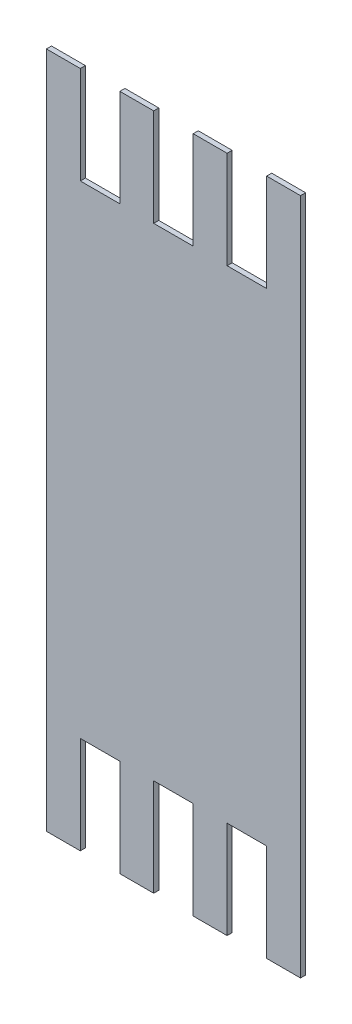
ISO-10303-21;
HEADER;
FILE_DESCRIPTION(('STEP AP214'),'2;1');
FILE_NAME('part.step','',(''),(''),'','','');
FILE_SCHEMA(('AUTOMOTIVE_DESIGN { 1 0 10303 214 1 1 1 1 }'));
ENDSEC;
DATA;
#1=APPLICATION_CONTEXT('core data for automotive mechanical design processes');
#2=APPLICATION_PROTOCOL_DEFINITION('international standard','automotive_design',2000,#1);
#3=PRODUCT_CONTEXT('',#1,'mechanical');
#4=PRODUCT('Part','Part','',(#3));
#5=PRODUCT_RELATED_PRODUCT_CATEGORY('part','',(#4));
#6=PRODUCT_DEFINITION_FORMATION('','',#4);
#7=PRODUCT_DEFINITION_CONTEXT('part definition',#1,'design');
#8=PRODUCT_DEFINITION('design','',#6,#7);
#9=PRODUCT_DEFINITION_SHAPE('','',#8);
#10=(LENGTH_UNIT() NAMED_UNIT(*) SI_UNIT(.MILLI.,.METRE.));
#11=(NAMED_UNIT(*) PLANE_ANGLE_UNIT() SI_UNIT($,.RADIAN.));
#12=(NAMED_UNIT(*) SI_UNIT($,.STERADIAN.) SOLID_ANGLE_UNIT());
#13=UNCERTAINTY_MEASURE_WITH_UNIT(LENGTH_MEASURE(1.E-05),#10,'distance_accuracy_value','');
#14=(GEOMETRIC_REPRESENTATION_CONTEXT(3) GLOBAL_UNCERTAINTY_ASSIGNED_CONTEXT((#13)) GLOBAL_UNIT_ASSIGNED_CONTEXT((#10,
#11,#12)) REPRESENTATION_CONTEXT('',''));
#15=CARTESIAN_POINT('',(0.,0.,0.));
#16=DIRECTION('',(0.,0.,1.));
#17=DIRECTION('',(1.,0.,0.));
#18=AXIS2_PLACEMENT_3D('',#15,#16,#17);
#19=CARTESIAN_POINT('',(5.904142E-11,-3.9153791E-10,0.03));
#20=DIRECTION('',(0.,0.,1.));
#21=DIRECTION('',(1.,0.,0.));
#22=AXIS2_PLACEMENT_3D('',#19,#20,#21);
#23=PLANE('',#22);
#24=DIRECTION('',(1.,0.,0.));
#25=VECTOR('',#24,1.);
#26=CARTESIAN_POINT('',(0.55,2.,0.03));
#27=LINE('',#26,#25);
#28=CARTESIAN_POINT('',(0.55,2.,0.03));
#29=VERTEX_POINT('',#28);
#30=CARTESIAN_POINT('',(0.75,2.,0.03));
#31=VERTEX_POINT('',#30);
#32=EDGE_CURVE('E649',#29,#31,#27,.T.);
#33=ORIENTED_EDGE('',*,*,#32,.F.);
#34=DIRECTION('',(0.,-1.,0.));
#35=VECTOR('',#34,1.);
#36=CARTESIAN_POINT('',(0.55,2.,0.03));
#37=LINE('',#36,#35);
#38=CARTESIAN_POINT('',(0.55,1.425,0.03));
#39=VERTEX_POINT('',#38);
#40=EDGE_CURVE('E11',#29,#39,#37,.T.);
#41=ORIENTED_EDGE('',*,*,#40,.T.);
#42=DIRECTION('',(-1.,0.,0.));
#43=VECTOR('',#42,1.);
#44=CARTESIAN_POINT('',(0.55,1.425,0.03));
#45=LINE('',#44,#43);
#46=CARTESIAN_POINT('',(0.316666666667,1.425,0.03));
#47=VERTEX_POINT('',#46);
#48=EDGE_CURVE('E330',#39,#47,#45,.T.);
#49=ORIENTED_EDGE('',*,*,#48,.T.);
#50=DIRECTION('',(0.,1.,0.));
#51=VECTOR('',#50,1.);
#52=CARTESIAN_POINT('',(0.316666666667,1.425,0.03));
#53=LINE('',#52,#51);
#54=CARTESIAN_POINT('',(0.316666666667,2.,0.03));
#55=VERTEX_POINT('',#54);
#56=EDGE_CURVE('E322',#47,#55,#53,.T.);
#57=ORIENTED_EDGE('',*,*,#56,.T.);
#58=DIRECTION('',(1.,0.,0.));
#59=VECTOR('',#58,1.);
#60=CARTESIAN_POINT('',(0.116666666667,2.,0.03));
#61=LINE('',#60,#59);
#62=CARTESIAN_POINT('',(0.116666666667,2.,0.03));
#63=VERTEX_POINT('',#62);
#64=EDGE_CURVE('E310',#63,#55,#61,.T.);
#65=ORIENTED_EDGE('',*,*,#64,.F.);
#66=DIRECTION('',(0.,-1.,0.));
#67=VECTOR('',#66,1.);
#68=CARTESIAN_POINT('',(0.116666666667,2.,0.03));
#69=LINE('',#68,#67);
#70=CARTESIAN_POINT('',(0.116666666667,1.425,0.03));
#71=VERTEX_POINT('',#70);
#72=EDGE_CURVE('E265',#63,#71,#69,.T.);
#73=ORIENTED_EDGE('',*,*,#72,.T.);
#74=DIRECTION('',(-1.,0.,0.));
#75=VECTOR('',#74,1.);
#76=CARTESIAN_POINT('',(0.116666666667,1.425,0.03));
#77=LINE('',#76,#75);
#78=CARTESIAN_POINT('',(-0.116666666667,1.425,0.03));
#79=VERTEX_POINT('',#78);
#80=EDGE_CURVE('E260',#71,#79,#77,.T.);
#81=ORIENTED_EDGE('',*,*,#80,.T.);
#82=DIRECTION('',(0.,1.,0.));
#83=VECTOR('',#82,1.);
#84=CARTESIAN_POINT('',(-0.116666666667,1.425,0.03));
#85=LINE('',#84,#83);
#86=CARTESIAN_POINT('',(-0.116666666667,2.,0.03));
#87=VERTEX_POINT('',#86);
#88=EDGE_CURVE('E262',#79,#87,#85,.T.);
#89=ORIENTED_EDGE('',*,*,#88,.T.);
#90=DIRECTION('',(1.,1.668697514E-08,0.));
#91=VECTOR('',#90,1.);
#92=CARTESIAN_POINT('',(-0.316666666667,1.999999996663,0.03));
#93=LINE('',#92,#91);
#94=CARTESIAN_POINT('',(-0.316666666667,1.999999996663,0.03));
#95=VERTEX_POINT('',#94);
#96=EDGE_CURVE('E752',#95,#87,#93,.T.);
#97=ORIENTED_EDGE('',*,*,#96,.F.);
#98=DIRECTION('',(0.,-1.,0.));
#99=VECTOR('',#98,1.);
#100=CARTESIAN_POINT('',(-0.316666666667,1.999999996663,0.03));
#101=LINE('',#100,#99);
#102=CARTESIAN_POINT('',(-0.316666666667,1.425,0.03));
#103=VERTEX_POINT('',#102);
#104=EDGE_CURVE('E755',#95,#103,#101,.T.);
#105=ORIENTED_EDGE('',*,*,#104,.T.);
#106=DIRECTION('',(-1.,0.,0.));
#107=VECTOR('',#106,1.);
#108=CARTESIAN_POINT('',(-0.316666666667,1.425,0.03));
#109=LINE('',#108,#107);
#110=CARTESIAN_POINT('',(-0.55,1.425,0.03));
#111=VERTEX_POINT('',#110);
#112=EDGE_CURVE('E740',#103,#111,#109,.T.);
#113=ORIENTED_EDGE('',*,*,#112,.T.);
#114=DIRECTION('',(0.,1.,0.));
#115=VECTOR('',#114,1.);
#116=CARTESIAN_POINT('',(-0.55,1.425,0.03));
#117=LINE('',#116,#115);
#118=CARTESIAN_POINT('',(-0.55,2.,0.03));
#119=VERTEX_POINT('',#118);
#120=EDGE_CURVE('E663',#111,#119,#117,.T.);
#121=ORIENTED_EDGE('',*,*,#120,.T.);
#122=DIRECTION('',(1.,0.,0.));
#123=VECTOR('',#122,1.);
#124=CARTESIAN_POINT('',(-0.75,2.,0.03));
#125=LINE('',#124,#123);
#126=CARTESIAN_POINT('',(-0.75,2.,0.03));
#127=VERTEX_POINT('',#126);
#128=EDGE_CURVE('E760',#127,#119,#125,.T.);
#129=ORIENTED_EDGE('',*,*,#128,.F.);
#130=DIRECTION('',(0.,1.,0.));
#131=VECTOR('',#130,1.);
#132=CARTESIAN_POINT('',(-0.75,-2.,0.03));
#133=LINE('',#132,#131);
#134=CARTESIAN_POINT('',(-0.75,-2.,0.03));
#135=VERTEX_POINT('',#134);
#136=EDGE_CURVE('E849',#135,#127,#133,.T.);
#137=ORIENTED_EDGE('',*,*,#136,.F.);
#138=DIRECTION('',(-1.,0.,0.));
#139=VECTOR('',#138,1.);
#140=CARTESIAN_POINT('',(-0.55,-2.,0.03));
#141=LINE('',#140,#139);
#142=CARTESIAN_POINT('',(-0.55,-2.,0.03));
#143=VERTEX_POINT('',#142);
#144=EDGE_CURVE('E711',#143,#135,#141,.T.);
#145=ORIENTED_EDGE('',*,*,#144,.F.);
#146=DIRECTION('',(0.,-1.,0.));
#147=VECTOR('',#146,1.);
#148=CARTESIAN_POINT('',(-0.55,-1.425,0.03));
#149=LINE('',#148,#147);
#150=CARTESIAN_POINT('',(-0.55,-1.425,0.03));
#151=VERTEX_POINT('',#150);
#152=EDGE_CURVE('E834',#151,#143,#149,.T.);
#153=ORIENTED_EDGE('',*,*,#152,.F.);
#154=DIRECTION('',(-1.,0.,0.));
#155=VECTOR('',#154,1.);
#156=CARTESIAN_POINT('',(-0.316666666667,-1.425,0.03));
#157=LINE('',#156,#155);
#158=CARTESIAN_POINT('',(-0.316666666667,-1.425,0.03));
#159=VERTEX_POINT('',#158);
#160=EDGE_CURVE('E826',#159,#151,#157,.T.);
#161=ORIENTED_EDGE('',*,*,#160,.F.);
#162=DIRECTION('',(0.,1.,0.));
#163=VECTOR('',#162,1.);
#164=CARTESIAN_POINT('',(-0.316666666667,-2.,0.03));
#165=LINE('',#164,#163);
#166=CARTESIAN_POINT('',(-0.316666666667,-2.,0.03));
#167=VERTEX_POINT('',#166);
#168=EDGE_CURVE('E812',#167,#159,#165,.T.);
#169=ORIENTED_EDGE('',*,*,#168,.F.);
#170=DIRECTION('',(1.,0.,0.));
#171=VECTOR('',#170,1.);
#172=CARTESIAN_POINT('',(-0.316666666667,-2.,0.03));
#173=LINE('',#172,#171);
#174=CARTESIAN_POINT('',(-0.116666666667,-2.,0.03));
#175=VERTEX_POINT('',#174);
#176=EDGE_CURVE('E805',#167,#175,#173,.T.);
#177=ORIENTED_EDGE('',*,*,#176,.T.);
#178=DIRECTION('',(0.,-1.,0.));
#179=VECTOR('',#178,1.);
#180=CARTESIAN_POINT('',(-0.116666666667,-1.425,0.03));
#181=LINE('',#180,#179);
#182=CARTESIAN_POINT('',(-0.116666666667,-1.425,0.03));
#183=VERTEX_POINT('',#182);
#184=EDGE_CURVE('E781',#183,#175,#181,.T.);
#185=ORIENTED_EDGE('',*,*,#184,.F.);
#186=DIRECTION('',(-1.,0.,0.));
#187=VECTOR('',#186,1.);
#188=CARTESIAN_POINT('',(0.116666666667,-1.425,0.03));
#189=LINE('',#188,#187);
#190=CARTESIAN_POINT('',(0.116666666667,-1.425,0.03));
#191=VERTEX_POINT('',#190);
#192=EDGE_CURVE('E718',#191,#183,#189,.T.);
#193=ORIENTED_EDGE('',*,*,#192,.F.);
#194=DIRECTION('',(0.,1.,0.));
#195=VECTOR('',#194,1.);
#196=CARTESIAN_POINT('',(0.116666666667,-2.,0.03));
#197=LINE('',#196,#195);
#198=CARTESIAN_POINT('',(0.116666666667,-2.,0.03));
#199=VERTEX_POINT('',#198);
#200=EDGE_CURVE('E751',#199,#191,#197,.T.);
#201=ORIENTED_EDGE('',*,*,#200,.F.);
#202=DIRECTION('',(1.,0.,0.));
#203=VECTOR('',#202,1.);
#204=CARTESIAN_POINT('',(0.116666666667,-2.,0.03));
#205=LINE('',#204,#203);
#206=CARTESIAN_POINT('',(0.316666666667,-2.,0.03));
#207=VERTEX_POINT('',#206);
#208=EDGE_CURVE('E693',#199,#207,#205,.T.);
#209=ORIENTED_EDGE('',*,*,#208,.T.);
#210=DIRECTION('',(0.,-1.,0.));
#211=VECTOR('',#210,1.);
#212=CARTESIAN_POINT('',(0.316666666667,-1.425,0.03));
#213=LINE('',#212,#211);
#214=CARTESIAN_POINT('',(0.316666666667,-1.425,0.03));
#215=VERTEX_POINT('',#214);
#216=EDGE_CURVE('E677',#215,#207,#213,.T.);
#217=ORIENTED_EDGE('',*,*,#216,.F.);
#218=DIRECTION('',(-1.,0.,0.));
#219=VECTOR('',#218,1.);
#220=CARTESIAN_POINT('',(0.55,-1.425,0.03));
#221=LINE('',#220,#219);
#222=CARTESIAN_POINT('',(0.55,-1.425,0.03));
#223=VERTEX_POINT('',#222);
#224=EDGE_CURVE('E726',#223,#215,#221,.T.);
#225=ORIENTED_EDGE('',*,*,#224,.F.);
#226=DIRECTION('',(0.,1.,0.));
#227=VECTOR('',#226,1.);
#228=CARTESIAN_POINT('',(0.55,-2.,0.03));
#229=LINE('',#228,#227);
#230=CARTESIAN_POINT('',(0.55,-2.,0.03));
#231=VERTEX_POINT('',#230);
#232=EDGE_CURVE('E702',#231,#223,#229,.T.);
#233=ORIENTED_EDGE('',*,*,#232,.F.);
#234=DIRECTION('',(-1.,0.,0.));
#235=VECTOR('',#234,1.);
#236=CARTESIAN_POINT('',(0.75,-2.,0.03));
#237=LINE('',#236,#235);
#238=CARTESIAN_POINT('',(0.75,-2.,0.03));
#239=VERTEX_POINT('',#238);
#240=EDGE_CURVE('E681',#239,#231,#237,.T.);
#241=ORIENTED_EDGE('',*,*,#240,.F.);
#242=DIRECTION('',(0.,-1.,0.));
#243=VECTOR('',#242,1.);
#244=CARTESIAN_POINT('',(0.75,2.,0.03));
#245=LINE('',#244,#243);
#246=EDGE_CURVE('E644',#31,#239,#245,.T.);
#247=ORIENTED_EDGE('',*,*,#246,.F.);
#248=EDGE_LOOP('',(#33,#41,#49,#57,#65,#73,#81,#89,#97,#105,#113,#121,#129,#137,#145,#153,#161,
#169,#177,#185,#193,#201,#209,#217,#225,#233,#241,#247));
#249=FACE_BOUND('',#248,.T.);
#250=ADVANCED_FACE('F17',(#249),#23,.T.);
#251=CARTESIAN_POINT('',(5.904142E-11,-3.9153791E-10,0.));
#252=DIRECTION('',(0.,0.,1.));
#253=DIRECTION('',(1.,0.,0.));
#254=AXIS2_PLACEMENT_3D('',#251,#252,#253);
#255=PLANE('',#254);
#256=DIRECTION('',(1.,0.,0.));
#257=VECTOR('',#256,1.);
#258=CARTESIAN_POINT('',(0.55,2.,0.));
#259=LINE('',#258,#257);
#260=CARTESIAN_POINT('',(0.55,2.,0.));
#261=VERTEX_POINT('',#260);
#262=CARTESIAN_POINT('',(0.75,2.,0.));
#263=VERTEX_POINT('',#262);
#264=EDGE_CURVE('E637',#261,#263,#259,.T.);
#265=ORIENTED_EDGE('',*,*,#264,.T.);
#266=DIRECTION('',(0.,-1.,0.));
#267=VECTOR('',#266,1.);
#268=CARTESIAN_POINT('',(0.75,2.,0.));
#269=LINE('',#268,#267);
#270=CARTESIAN_POINT('',(0.75,-2.,0.));
#271=VERTEX_POINT('',#270);
#272=EDGE_CURVE('E640',#263,#271,#269,.T.);
#273=ORIENTED_EDGE('',*,*,#272,.T.);
#274=DIRECTION('',(-1.,0.,0.));
#275=VECTOR('',#274,1.);
#276=CARTESIAN_POINT('',(0.75,-2.,0.));
#277=LINE('',#276,#275);
#278=CARTESIAN_POINT('',(0.55,-2.,0.));
#279=VERTEX_POINT('',#278);
#280=EDGE_CURVE('E699',#271,#279,#277,.T.);
#281=ORIENTED_EDGE('',*,*,#280,.T.);
#282=DIRECTION('',(0.,1.,0.));
#283=VECTOR('',#282,1.);
#284=CARTESIAN_POINT('',(0.55,-2.,0.));
#285=LINE('',#284,#283);
#286=CARTESIAN_POINT('',(0.55,-1.425,0.));
#287=VERTEX_POINT('',#286);
#288=EDGE_CURVE('E722',#279,#287,#285,.T.);
#289=ORIENTED_EDGE('',*,*,#288,.T.);
#290=DIRECTION('',(-1.,0.,0.));
#291=VECTOR('',#290,1.);
#292=CARTESIAN_POINT('',(0.55,-1.425,0.));
#293=LINE('',#292,#291);
#294=CARTESIAN_POINT('',(0.316666666667,-1.425,0.));
#295=VERTEX_POINT('',#294);
#296=EDGE_CURVE('E673',#287,#295,#293,.T.);
#297=ORIENTED_EDGE('',*,*,#296,.T.);
#298=DIRECTION('',(0.,-1.,0.));
#299=VECTOR('',#298,1.);
#300=CARTESIAN_POINT('',(0.316666666667,-1.425,0.));
#301=LINE('',#300,#299);
#302=CARTESIAN_POINT('',(0.316666666667,-2.,0.));
#303=VERTEX_POINT('',#302);
#304=EDGE_CURVE('E737',#295,#303,#301,.T.);
#305=ORIENTED_EDGE('',*,*,#304,.T.);
#306=DIRECTION('',(1.,0.,0.));
#307=VECTOR('',#306,1.);
#308=CARTESIAN_POINT('',(0.116666666667,-2.,0.));
#309=LINE('',#308,#307);
#310=CARTESIAN_POINT('',(0.116666666667,-2.,0.));
#311=VERTEX_POINT('',#310);
#312=EDGE_CURVE('E690',#311,#303,#309,.T.);
#313=ORIENTED_EDGE('',*,*,#312,.F.);
#314=DIRECTION('',(0.,1.,0.));
#315=VECTOR('',#314,1.);
#316=CARTESIAN_POINT('',(0.116666666667,-2.,0.));
#317=LINE('',#316,#315);
#318=CARTESIAN_POINT('',(0.116666666667,-1.425,0.));
#319=VERTEX_POINT('',#318);
#320=EDGE_CURVE('E768',#311,#319,#317,.T.);
#321=ORIENTED_EDGE('',*,*,#320,.T.);
#322=DIRECTION('',(-1.,0.,0.));
#323=VECTOR('',#322,1.);
#324=CARTESIAN_POINT('',(0.116666666667,-1.425,0.));
#325=LINE('',#324,#323);
#326=CARTESIAN_POINT('',(-0.116666666667,-1.425,0.));
#327=VERTEX_POINT('',#326);
#328=EDGE_CURVE('E717',#319,#327,#325,.T.);
#329=ORIENTED_EDGE('',*,*,#328,.T.);
#330=DIRECTION('',(0.,-1.,0.));
#331=VECTOR('',#330,1.);
#332=CARTESIAN_POINT('',(-0.116666666667,-1.425,0.));
#333=LINE('',#332,#331);
#334=CARTESIAN_POINT('',(-0.116666666667,-2.,0.));
#335=VERTEX_POINT('',#334);
#336=EDGE_CURVE('E791',#327,#335,#333,.T.);
#337=ORIENTED_EDGE('',*,*,#336,.T.);
#338=DIRECTION('',(1.,0.,0.));
#339=VECTOR('',#338,1.);
#340=CARTESIAN_POINT('',(-0.316666666667,-2.,0.));
#341=LINE('',#340,#339);
#342=CARTESIAN_POINT('',(-0.316666666667,-2.,0.));
#343=VERTEX_POINT('',#342);
#344=EDGE_CURVE('E799',#343,#335,#341,.T.);
#345=ORIENTED_EDGE('',*,*,#344,.F.);
#346=DIRECTION('',(0.,1.,0.));
#347=VECTOR('',#346,1.);
#348=CARTESIAN_POINT('',(-0.316666666667,-2.,0.));
#349=LINE('',#348,#347);
#350=CARTESIAN_POINT('',(-0.316666666667,-1.425,0.));
#351=VERTEX_POINT('',#350);
#352=EDGE_CURVE('E822',#343,#351,#349,.T.);
#353=ORIENTED_EDGE('',*,*,#352,.T.);
#354=DIRECTION('',(-1.,0.,0.));
#355=VECTOR('',#354,1.);
#356=CARTESIAN_POINT('',(-0.316666666667,-1.425,0.));
#357=LINE('',#356,#355);
#358=CARTESIAN_POINT('',(-0.55,-1.425,0.));
#359=VERTEX_POINT('',#358);
#360=EDGE_CURVE('E830',#351,#359,#357,.T.);
#361=ORIENTED_EDGE('',*,*,#360,.T.);
#362=DIRECTION('',(0.,-1.,0.));
#363=VECTOR('',#362,1.);
#364=CARTESIAN_POINT('',(-0.55,-1.425,0.));
#365=LINE('',#364,#363);
#366=CARTESIAN_POINT('',(-0.55,-2.,0.));
#367=VERTEX_POINT('',#366);
#368=EDGE_CURVE('E707',#359,#367,#365,.T.);
#369=ORIENTED_EDGE('',*,*,#368,.T.);
#370=DIRECTION('',(-1.,0.,0.));
#371=VECTOR('',#370,1.);
#372=CARTESIAN_POINT('',(-0.55,-2.,0.));
#373=LINE('',#372,#371);
#374=CARTESIAN_POINT('',(-0.75,-2.,0.));
#375=VERTEX_POINT('',#374);
#376=EDGE_CURVE('E821',#367,#375,#373,.T.);
#377=ORIENTED_EDGE('',*,*,#376,.T.);
#378=DIRECTION('',(0.,1.,0.));
#379=VECTOR('',#378,1.);
#380=CARTESIAN_POINT('',(-0.75,-2.,0.));
#381=LINE('',#380,#379);
#382=CARTESIAN_POINT('',(-0.75,2.,0.));
#383=VERTEX_POINT('',#382);
#384=EDGE_CURVE('E764',#375,#383,#381,.T.);
#385=ORIENTED_EDGE('',*,*,#384,.T.);
#386=DIRECTION('',(1.,0.,0.));
#387=VECTOR('',#386,1.);
#388=CARTESIAN_POINT('',(-0.75,2.,0.));
#389=LINE('',#388,#387);
#390=CARTESIAN_POINT('',(-0.55,2.,0.));
#391=VERTEX_POINT('',#390);
#392=EDGE_CURVE('E667',#383,#391,#389,.T.);
#393=ORIENTED_EDGE('',*,*,#392,.T.);
#394=DIRECTION('',(0.,1.,0.));
#395=VECTOR('',#394,1.);
#396=CARTESIAN_POINT('',(-0.55,1.425,0.));
#397=LINE('',#396,#395);
#398=CARTESIAN_POINT('',(-0.55,1.425,0.));
#399=VERTEX_POINT('',#398);
#400=EDGE_CURVE('E666',#399,#391,#397,.T.);
#401=ORIENTED_EDGE('',*,*,#400,.F.);
#402=DIRECTION('',(-1.,0.,0.));
#403=VECTOR('',#402,1.);
#404=CARTESIAN_POINT('',(-0.316666666667,1.425,0.));
#405=LINE('',#404,#403);
#406=CARTESIAN_POINT('',(-0.316666666667,1.425,0.));
#407=VERTEX_POINT('',#406);
#408=EDGE_CURVE('E686',#407,#399,#405,.T.);
#409=ORIENTED_EDGE('',*,*,#408,.F.);
#410=DIRECTION('',(0.,-1.,0.));
#411=VECTOR('',#410,1.);
#412=CARTESIAN_POINT('',(-0.316666666667,1.999999996663,0.));
#413=LINE('',#412,#411);
#414=CARTESIAN_POINT('',(-0.316666666667,1.999999996663,0.));
#415=VERTEX_POINT('',#414);
#416=EDGE_CURVE('E769',#415,#407,#413,.T.);
#417=ORIENTED_EDGE('',*,*,#416,.F.);
#418=DIRECTION('',(1.,1.668697514E-08,0.));
#419=VECTOR('',#418,1.);
#420=CARTESIAN_POINT('',(-0.316666666667,1.999999996663,0.));
#421=LINE('',#420,#419);
#422=CARTESIAN_POINT('',(-0.116666666667,2.,0.));
#423=VERTEX_POINT('',#422);
#424=EDGE_CURVE('E289',#415,#423,#421,.T.);
#425=ORIENTED_EDGE('',*,*,#424,.T.);
#426=DIRECTION('',(0.,1.,0.));
#427=VECTOR('',#426,1.);
#428=CARTESIAN_POINT('',(-0.116666666667,1.425,0.));
#429=LINE('',#428,#427);
#430=CARTESIAN_POINT('',(-0.116666666667,1.425,0.));
#431=VERTEX_POINT('',#430);
#432=EDGE_CURVE('E283',#431,#423,#429,.T.);
#433=ORIENTED_EDGE('',*,*,#432,.F.);
#434=DIRECTION('',(-1.,0.,0.));
#435=VECTOR('',#434,1.);
#436=CARTESIAN_POINT('',(0.116666666667,1.425,0.));
#437=LINE('',#436,#435);
#438=CARTESIAN_POINT('',(0.116666666667,1.425,0.));
#439=VERTEX_POINT('',#438);
#440=EDGE_CURVE('E272',#439,#431,#437,.T.);
#441=ORIENTED_EDGE('',*,*,#440,.F.);
#442=DIRECTION('',(0.,-1.,0.));
#443=VECTOR('',#442,1.);
#444=CARTESIAN_POINT('',(0.116666666667,2.,0.));
#445=LINE('',#444,#443);
#446=CARTESIAN_POINT('',(0.116666666667,2.,0.));
#447=VERTEX_POINT('',#446);
#448=EDGE_CURVE('E307',#447,#439,#445,.T.);
#449=ORIENTED_EDGE('',*,*,#448,.F.);
#450=DIRECTION('',(1.,0.,0.));
#451=VECTOR('',#450,1.);
#452=CARTESIAN_POINT('',(0.116666666667,2.,0.));
#453=LINE('',#452,#451);
#454=CARTESIAN_POINT('',(0.316666666667,2.,0.));
#455=VERTEX_POINT('',#454);
#456=EDGE_CURVE('E317',#447,#455,#453,.T.);
#457=ORIENTED_EDGE('',*,*,#456,.T.);
#458=DIRECTION('',(0.,1.,0.));
#459=VECTOR('',#458,1.);
#460=CARTESIAN_POINT('',(0.316666666667,1.425,0.));
#461=LINE('',#460,#459);
#462=CARTESIAN_POINT('',(0.316666666667,1.425,0.));
#463=VERTEX_POINT('',#462);
#464=EDGE_CURVE('E326',#463,#455,#461,.T.);
#465=ORIENTED_EDGE('',*,*,#464,.F.);
#466=DIRECTION('',(-1.,0.,0.));
#467=VECTOR('',#466,1.);
#468=CARTESIAN_POINT('',(0.55,1.425,0.));
#469=LINE('',#468,#467);
#470=CARTESIAN_POINT('',(0.55,1.425,0.));
#471=VERTEX_POINT('',#470);
#472=EDGE_CURVE('E329',#471,#463,#469,.T.);
#473=ORIENTED_EDGE('',*,*,#472,.F.);
#474=DIRECTION('',(0.,-1.,0.));
#475=VECTOR('',#474,1.);
#476=CARTESIAN_POINT('',(0.55,2.,0.));
#477=LINE('',#476,#475);
#478=EDGE_CURVE('E25',#261,#471,#477,.T.);
#479=ORIENTED_EDGE('',*,*,#478,.F.);
#480=EDGE_LOOP('',(#265,#273,#281,#289,#297,#305,#313,#321,#329,#337,#345,#353,#361,#369,#377,
#385,#393,#401,#409,#417,#425,#433,#441,#449,#457,#465,#473,#479));
#481=FACE_BOUND('',#480,.T.);
#482=ADVANCED_FACE('F584',(#481),#255,.F.);
#483=CARTESIAN_POINT('',(0.55,2.,0.));
#484=DIRECTION('',(1.,0.,0.));
#485=DIRECTION('',(0.,1.,0.));
#486=AXIS2_PLACEMENT_3D('',#483,#484,#485);
#487=PLANE('',#486);
#488=DIRECTION('',(0.,0.,1.));
#489=VECTOR('',#488,1.);
#490=CARTESIAN_POINT('',(0.55,2.,0.));
#491=LINE('',#490,#489);
#492=EDGE_CURVE('E657',#261,#29,#491,.T.);
#493=ORIENTED_EDGE('',*,*,#492,.F.);
#494=ORIENTED_EDGE('',*,*,#478,.T.);
#495=DIRECTION('',(0.,0.,1.));
#496=VECTOR('',#495,1.);
#497=CARTESIAN_POINT('',(0.55,1.425,0.));
#498=LINE('',#497,#496);
#499=EDGE_CURVE('E325',#471,#39,#498,.T.);
#500=ORIENTED_EDGE('',*,*,#499,.T.);
#501=ORIENTED_EDGE('',*,*,#40,.F.);
#502=EDGE_LOOP('',(#493,#494,#500,#501));
#503=FACE_BOUND('',#502,.T.);
#504=ADVANCED_FACE('F551',(#503),#487,.F.);
#505=CARTESIAN_POINT('',(0.55,1.425,0.));
#506=DIRECTION('',(0.,-1.,0.));
#507=DIRECTION('',(0.,0.,-1.));
#508=AXIS2_PLACEMENT_3D('',#505,#506,#507);
#509=PLANE('',#508);
#510=ORIENTED_EDGE('',*,*,#499,.F.);
#511=ORIENTED_EDGE('',*,*,#472,.T.);
#512=DIRECTION('',(0.,0.,1.));
#513=VECTOR('',#512,1.);
#514=CARTESIAN_POINT('',(0.316666666667,1.425,0.));
#515=LINE('',#514,#513);
#516=EDGE_CURVE('E321',#463,#47,#515,.T.);
#517=ORIENTED_EDGE('',*,*,#516,.T.);
#518=ORIENTED_EDGE('',*,*,#48,.F.);
#519=EDGE_LOOP('',(#510,#511,#517,#518));
#520=FACE_BOUND('',#519,.T.);
#521=ADVANCED_FACE('F545',(#520),#509,.F.);
#522=CARTESIAN_POINT('',(0.316666666667,1.425,0.));
#523=DIRECTION('',(-1.,0.,0.));
#524=DIRECTION('',(0.,0.,1.));
#525=AXIS2_PLACEMENT_3D('',#522,#523,#524);
#526=PLANE('',#525);
#527=ORIENTED_EDGE('',*,*,#516,.F.);
#528=ORIENTED_EDGE('',*,*,#464,.T.);
#529=DIRECTION('',(0.,0.,1.));
#530=VECTOR('',#529,1.);
#531=CARTESIAN_POINT('',(0.316666666667,2.,0.));
#532=LINE('',#531,#530);
#533=EDGE_CURVE('E316',#455,#55,#532,.T.);
#534=ORIENTED_EDGE('',*,*,#533,.T.);
#535=ORIENTED_EDGE('',*,*,#56,.F.);
#536=EDGE_LOOP('',(#527,#528,#534,#535));
#537=FACE_BOUND('',#536,.T.);
#538=ADVANCED_FACE('F550',(#537),#526,.F.);
#539=CARTESIAN_POINT('',(0.116666666667,2.,0.));
#540=DIRECTION('',(0.,1.,0.));
#541=DIRECTION('',(1.,0.,0.));
#542=AXIS2_PLACEMENT_3D('',#539,#540,#541);
#543=PLANE('',#542);
#544=DIRECTION('',(0.,0.,1.));
#545=VECTOR('',#544,1.);
#546=CARTESIAN_POINT('',(0.116666666667,2.,0.));
#547=LINE('',#546,#545);
#548=EDGE_CURVE('E271',#447,#63,#547,.T.);
#549=ORIENTED_EDGE('',*,*,#548,.T.);
#550=ORIENTED_EDGE('',*,*,#64,.T.);
#551=ORIENTED_EDGE('',*,*,#533,.F.);
#552=ORIENTED_EDGE('',*,*,#456,.F.);
#553=EDGE_LOOP('',(#549,#550,#551,#552));
#554=FACE_BOUND('',#553,.T.);
#555=ADVANCED_FACE('F561',(#554),#543,.T.);
#556=CARTESIAN_POINT('',(0.116666666667,2.,0.));
#557=DIRECTION('',(1.,0.,0.));
#558=DIRECTION('',(0.,1.,0.));
#559=AXIS2_PLACEMENT_3D('',#556,#557,#558);
#560=PLANE('',#559);
#561=ORIENTED_EDGE('',*,*,#548,.F.);
#562=ORIENTED_EDGE('',*,*,#448,.T.);
#563=DIRECTION('',(0.,0.,1.));
#564=VECTOR('',#563,1.);
#565=CARTESIAN_POINT('',(0.116666666667,1.425,0.));
#566=LINE('',#565,#564);
#567=EDGE_CURVE('E282',#439,#71,#566,.T.);
#568=ORIENTED_EDGE('',*,*,#567,.T.);
#569=ORIENTED_EDGE('',*,*,#72,.F.);
#570=EDGE_LOOP('',(#561,#562,#568,#569));
#571=FACE_BOUND('',#570,.T.);
#572=ADVANCED_FACE('F498',(#571),#560,.F.);
#573=CARTESIAN_POINT('',(0.116666666667,1.425,0.));
#574=DIRECTION('',(0.,-1.,0.));
#575=DIRECTION('',(0.,0.,-1.));
#576=AXIS2_PLACEMENT_3D('',#573,#574,#575);
#577=PLANE('',#576);
#578=ORIENTED_EDGE('',*,*,#567,.F.);
#579=ORIENTED_EDGE('',*,*,#440,.T.);
#580=DIRECTION('',(0.,0.,1.));
#581=VECTOR('',#580,1.);
#582=CARTESIAN_POINT('',(-0.116666666667,1.425,0.));
#583=LINE('',#582,#581);
#584=EDGE_CURVE('E277',#431,#79,#583,.T.);
#585=ORIENTED_EDGE('',*,*,#584,.T.);
#586=ORIENTED_EDGE('',*,*,#80,.F.);
#587=EDGE_LOOP('',(#578,#579,#585,#586));
#588=FACE_BOUND('',#587,.T.);
#589=ADVANCED_FACE('F285',(#588),#577,.F.);
#590=CARTESIAN_POINT('',(-0.116666666667,1.425,0.));
#591=DIRECTION('',(-1.,0.,0.));
#592=DIRECTION('',(0.,0.,1.));
#593=AXIS2_PLACEMENT_3D('',#590,#591,#592);
#594=PLANE('',#593);
#595=ORIENTED_EDGE('',*,*,#584,.F.);
#596=ORIENTED_EDGE('',*,*,#432,.T.);
#597=DIRECTION('',(0.,0.,1.));
#598=VECTOR('',#597,1.);
#599=CARTESIAN_POINT('',(-0.116666666667,2.,0.));
#600=LINE('',#599,#598);
#601=EDGE_CURVE('E279',#423,#87,#600,.T.);
#602=ORIENTED_EDGE('',*,*,#601,.T.);
#603=ORIENTED_EDGE('',*,*,#88,.F.);
#604=EDGE_LOOP('',(#595,#596,#602,#603));
#605=FACE_BOUND('',#604,.T.);
#606=ADVANCED_FACE('F276',(#605),#594,.F.);
#607=CARTESIAN_POINT('',(-0.316666666667,1.999999996663,0.));
#608=DIRECTION('',(-1.668697514E-08,1.,0.));
#609=DIRECTION('',(0.,0.,1.));
#610=AXIS2_PLACEMENT_3D('',#607,#608,#609);
#611=PLANE('',#610);
#612=DIRECTION('',(0.,0.,1.));
#613=VECTOR('',#612,1.);
#614=CARTESIAN_POINT('',(-0.316666666667,1.999999996663,0.));
#615=LINE('',#614,#613);
#616=EDGE_CURVE('E299',#415,#95,#615,.T.);
#617=ORIENTED_EDGE('',*,*,#616,.T.);
#618=ORIENTED_EDGE('',*,*,#96,.T.);
#619=ORIENTED_EDGE('',*,*,#601,.F.);
#620=ORIENTED_EDGE('',*,*,#424,.F.);
#621=EDGE_LOOP('',(#617,#618,#619,#620));
#622=FACE_BOUND('',#621,.T.);
#623=ADVANCED_FACE('F465',(#622),#611,.T.);
#624=CARTESIAN_POINT('',(-0.316666666667,1.999999996663,0.));
#625=DIRECTION('',(1.,0.,0.));
#626=DIRECTION('',(0.,1.,0.));
#627=AXIS2_PLACEMENT_3D('',#624,#625,#626);
#628=PLANE('',#627);
#629=ORIENTED_EDGE('',*,*,#616,.F.);
#630=ORIENTED_EDGE('',*,*,#416,.T.);
#631=DIRECTION('',(0.,0.,1.));
#632=VECTOR('',#631,1.);
#633=CARTESIAN_POINT('',(-0.316666666667,1.425,0.));
#634=LINE('',#633,#632);
#635=EDGE_CURVE('E665',#407,#103,#634,.T.);
#636=ORIENTED_EDGE('',*,*,#635,.T.);
#637=ORIENTED_EDGE('',*,*,#104,.F.);
#638=EDGE_LOOP('',(#629,#630,#636,#637));
#639=FACE_BOUND('',#638,.T.);
#640=ADVANCED_FACE('F460',(#639),#628,.F.);
#641=CARTESIAN_POINT('',(-0.316666666667,1.425,0.));
#642=DIRECTION('',(0.,-1.,0.));
#643=DIRECTION('',(0.,0.,-1.));
#644=AXIS2_PLACEMENT_3D('',#641,#642,#643);
#645=PLANE('',#644);
#646=ORIENTED_EDGE('',*,*,#635,.F.);
#647=ORIENTED_EDGE('',*,*,#408,.T.);
#648=DIRECTION('',(0.,0.,1.));
#649=VECTOR('',#648,1.);
#650=CARTESIAN_POINT('',(-0.55,1.425,0.));
#651=LINE('',#650,#649);
#652=EDGE_CURVE('E670',#399,#111,#651,.T.);
#653=ORIENTED_EDGE('',*,*,#652,.T.);
#654=ORIENTED_EDGE('',*,*,#112,.F.);
#655=EDGE_LOOP('',(#646,#647,#653,#654));
#656=FACE_BOUND('',#655,.T.);
#657=ADVANCED_FACE('F444',(#656),#645,.F.);
#658=CARTESIAN_POINT('',(-0.55,1.425,0.));
#659=DIRECTION('',(-1.,0.,0.));
#660=DIRECTION('',(0.,0.,1.));
#661=AXIS2_PLACEMENT_3D('',#658,#659,#660);
#662=PLANE('',#661);
#663=ORIENTED_EDGE('',*,*,#652,.F.);
#664=ORIENTED_EDGE('',*,*,#400,.T.);
#665=DIRECTION('',(0.,0.,1.));
#666=VECTOR('',#665,1.);
#667=CARTESIAN_POINT('',(-0.55,2.,0.));
#668=LINE('',#667,#666);
#669=EDGE_CURVE('E671',#391,#119,#668,.T.);
#670=ORIENTED_EDGE('',*,*,#669,.T.);
#671=ORIENTED_EDGE('',*,*,#120,.F.);
#672=EDGE_LOOP('',(#663,#664,#670,#671));
#673=FACE_BOUND('',#672,.T.);
#674=ADVANCED_FACE('F438',(#673),#662,.F.);
#675=CARTESIAN_POINT('',(-0.75,2.,0.));
#676=DIRECTION('',(0.,1.,0.));
#677=DIRECTION('',(1.,0.,0.));
#678=AXIS2_PLACEMENT_3D('',#675,#676,#677);
#679=PLANE('',#678);
#680=DIRECTION('',(0.,0.,1.));
#681=VECTOR('',#680,1.);
#682=CARTESIAN_POINT('',(-0.75,2.,0.));
#683=LINE('',#682,#681);
#684=EDGE_CURVE('E809',#383,#127,#683,.T.);
#685=ORIENTED_EDGE('',*,*,#684,.T.);
#686=ORIENTED_EDGE('',*,*,#128,.T.);
#687=ORIENTED_EDGE('',*,*,#669,.F.);
#688=ORIENTED_EDGE('',*,*,#392,.F.);
#689=EDGE_LOOP('',(#685,#686,#687,#688));
#690=FACE_BOUND('',#689,.T.);
#691=ADVANCED_FACE('F443',(#690),#679,.T.);
#692=CARTESIAN_POINT('',(-0.75,-2.,0.));
#693=DIRECTION('',(-1.,0.,0.));
#694=DIRECTION('',(0.,0.,1.));
#695=AXIS2_PLACEMENT_3D('',#692,#693,#694);
#696=PLANE('',#695);
#697=DIRECTION('',(0.,0.,1.));
#698=VECTOR('',#697,1.);
#699=CARTESIAN_POINT('',(-0.75,-2.,0.));
#700=LINE('',#699,#698);
#701=EDGE_CURVE('E817',#375,#135,#700,.T.);
#702=ORIENTED_EDGE('',*,*,#701,.T.);
#703=ORIENTED_EDGE('',*,*,#136,.T.);
#704=ORIENTED_EDGE('',*,*,#684,.F.);
#705=ORIENTED_EDGE('',*,*,#384,.F.);
#706=EDGE_LOOP('',(#702,#703,#704,#705));
#707=FACE_BOUND('',#706,.T.);
#708=ADVANCED_FACE('F474',(#707),#696,.T.);
#709=CARTESIAN_POINT('',(-0.55,-2.,0.));
#710=DIRECTION('',(0.,-1.,0.));
#711=DIRECTION('',(0.,0.,-1.));
#712=AXIS2_PLACEMENT_3D('',#709,#710,#711);
#713=PLANE('',#712);
#714=DIRECTION('',(0.,0.,1.));
#715=VECTOR('',#714,1.);
#716=CARTESIAN_POINT('',(-0.55,-2.,0.));
#717=LINE('',#716,#715);
#718=EDGE_CURVE('E712',#367,#143,#717,.T.);
#719=ORIENTED_EDGE('',*,*,#718,.T.);
#720=ORIENTED_EDGE('',*,*,#144,.T.);
#721=ORIENTED_EDGE('',*,*,#701,.F.);
#722=ORIENTED_EDGE('',*,*,#376,.F.);
#723=EDGE_LOOP('',(#719,#720,#721,#722));
#724=FACE_BOUND('',#723,.T.);
#725=ADVANCED_FACE('F345',(#724),#713,.T.);
#726=CARTESIAN_POINT('',(-0.55,-1.425,0.));
#727=DIRECTION('',(1.,0.,0.));
#728=DIRECTION('',(0.,1.,0.));
#729=AXIS2_PLACEMENT_3D('',#726,#727,#728);
#730=PLANE('',#729);
#731=DIRECTION('',(0.,0.,1.));
#732=VECTOR('',#731,1.);
#733=CARTESIAN_POINT('',(-0.55,-1.425,0.));
#734=LINE('',#733,#732);
#735=EDGE_CURVE('E661',#359,#151,#734,.T.);
#736=ORIENTED_EDGE('',*,*,#735,.T.);
#737=ORIENTED_EDGE('',*,*,#152,.T.);
#738=ORIENTED_EDGE('',*,*,#718,.F.);
#739=ORIENTED_EDGE('',*,*,#368,.F.);
#740=EDGE_LOOP('',(#736,#737,#738,#739));
#741=FACE_BOUND('',#740,.T.);
#742=ADVANCED_FACE('F339',(#741),#730,.T.);
#743=CARTESIAN_POINT('',(-0.316666666667,-1.425,0.));
#744=DIRECTION('',(0.,-1.,0.));
#745=DIRECTION('',(0.,0.,-1.));
#746=AXIS2_PLACEMENT_3D('',#743,#744,#745);
#747=PLANE('',#746);
#748=DIRECTION('',(0.,0.,1.));
#749=VECTOR('',#748,1.);
#750=CARTESIAN_POINT('',(-0.316666666667,-1.425,0.));
#751=LINE('',#750,#749);
#752=EDGE_CURVE('E816',#351,#159,#751,.T.);
#753=ORIENTED_EDGE('',*,*,#752,.T.);
#754=ORIENTED_EDGE('',*,*,#160,.T.);
#755=ORIENTED_EDGE('',*,*,#735,.F.);
#756=ORIENTED_EDGE('',*,*,#360,.F.);
#757=EDGE_LOOP('',(#753,#754,#755,#756));
#758=FACE_BOUND('',#757,.T.);
#759=ADVANCED_FACE('F344',(#758),#747,.T.);
#760=CARTESIAN_POINT('',(-0.316666666667,-2.,0.));
#761=DIRECTION('',(-1.,0.,0.));
#762=DIRECTION('',(0.,0.,1.));
#763=AXIS2_PLACEMENT_3D('',#760,#761,#762);
#764=PLANE('',#763);
#765=DIRECTION('',(0.,0.,1.));
#766=VECTOR('',#765,1.);
#767=CARTESIAN_POINT('',(-0.316666666667,-2.,0.));
#768=LINE('',#767,#766);
#769=EDGE_CURVE('E795',#343,#167,#768,.T.);
#770=ORIENTED_EDGE('',*,*,#769,.T.);
#771=ORIENTED_EDGE('',*,*,#168,.T.);
#772=ORIENTED_EDGE('',*,*,#752,.F.);
#773=ORIENTED_EDGE('',*,*,#352,.F.);
#774=EDGE_LOOP('',(#770,#771,#772,#773));
#775=FACE_BOUND('',#774,.T.);
#776=ADVANCED_FACE('F409',(#775),#764,.T.);
#777=CARTESIAN_POINT('',(-0.316666666667,-2.,0.));
#778=DIRECTION('',(0.,1.,0.));
#779=DIRECTION('',(1.,0.,0.));
#780=AXIS2_PLACEMENT_3D('',#777,#778,#779);
#781=PLANE('',#780);
#782=ORIENTED_EDGE('',*,*,#769,.F.);
#783=ORIENTED_EDGE('',*,*,#344,.T.);
#784=DIRECTION('',(0.,0.,1.));
#785=VECTOR('',#784,1.);
#786=CARTESIAN_POINT('',(-0.116666666667,-2.,0.));
#787=LINE('',#786,#785);
#788=EDGE_CURVE('E785',#335,#175,#787,.T.);
#789=ORIENTED_EDGE('',*,*,#788,.T.);
#790=ORIENTED_EDGE('',*,*,#176,.F.);
#791=EDGE_LOOP('',(#782,#783,#789,#790));
#792=FACE_BOUND('',#791,.T.);
#793=ADVANCED_FACE('F414',(#792),#781,.F.);
#794=CARTESIAN_POINT('',(-0.116666666667,-1.425,0.));
#795=DIRECTION('',(1.,0.,0.));
#796=DIRECTION('',(0.,1.,0.));
#797=AXIS2_PLACEMENT_3D('',#794,#795,#796);
#798=PLANE('',#797);
#799=DIRECTION('',(0.,0.,1.));
#800=VECTOR('',#799,1.);
#801=CARTESIAN_POINT('',(-0.116666666667,-1.425,0.));
#802=LINE('',#801,#800);
#803=EDGE_CURVE('E713',#327,#183,#802,.T.);
#804=ORIENTED_EDGE('',*,*,#803,.T.);
#805=ORIENTED_EDGE('',*,*,#184,.T.);
#806=ORIENTED_EDGE('',*,*,#788,.F.);
#807=ORIENTED_EDGE('',*,*,#336,.F.);
#808=EDGE_LOOP('',(#804,#805,#806,#807));
#809=FACE_BOUND('',#808,.T.);
#810=ADVANCED_FACE('F427',(#809),#798,.T.);
#811=CARTESIAN_POINT('',(0.116666666667,-1.425,0.));
#812=DIRECTION('',(0.,-1.,0.));
#813=DIRECTION('',(0.,0.,-1.));
#814=AXIS2_PLACEMENT_3D('',#811,#812,#813);
#815=PLANE('',#814);
#816=DIRECTION('',(0.,0.,1.));
#817=VECTOR('',#816,1.);
#818=CARTESIAN_POINT('',(0.116666666667,-1.425,0.));
#819=LINE('',#818,#817);
#820=EDGE_CURVE('E759',#319,#191,#819,.T.);
#821=ORIENTED_EDGE('',*,*,#820,.T.);
#822=ORIENTED_EDGE('',*,*,#192,.T.);
#823=ORIENTED_EDGE('',*,*,#803,.F.);
#824=ORIENTED_EDGE('',*,*,#328,.F.);
#825=EDGE_LOOP('',(#821,#822,#823,#824));
#826=FACE_BOUND('',#825,.T.);
#827=ADVANCED_FACE('F432',(#826),#815,.T.);
#828=CARTESIAN_POINT('',(0.116666666667,-2.,0.));
#829=DIRECTION('',(-1.,0.,0.));
#830=DIRECTION('',(0.,0.,1.));
#831=AXIS2_PLACEMENT_3D('',#828,#829,#830);
#832=PLANE('',#831);
#833=DIRECTION('',(0.,0.,1.));
#834=VECTOR('',#833,1.);
#835=CARTESIAN_POINT('',(0.116666666667,-2.,0.));
#836=LINE('',#835,#834);
#837=EDGE_CURVE('E694',#311,#199,#836,.T.);
#838=ORIENTED_EDGE('',*,*,#837,.T.);
#839=ORIENTED_EDGE('',*,*,#200,.T.);
#840=ORIENTED_EDGE('',*,*,#820,.F.);
#841=ORIENTED_EDGE('',*,*,#320,.F.);
#842=EDGE_LOOP('',(#838,#839,#840,#841));
#843=FACE_BOUND('',#842,.T.);
#844=ADVANCED_FACE('F454',(#843),#832,.T.);
#845=CARTESIAN_POINT('',(0.116666666667,-2.,0.));
#846=DIRECTION('',(0.,1.,0.));
#847=DIRECTION('',(1.,0.,0.));
#848=AXIS2_PLACEMENT_3D('',#845,#846,#847);
#849=PLANE('',#848);
#850=ORIENTED_EDGE('',*,*,#837,.F.);
#851=ORIENTED_EDGE('',*,*,#312,.T.);
#852=DIRECTION('',(0.,0.,1.));
#853=VECTOR('',#852,1.);
#854=CARTESIAN_POINT('',(0.316666666667,-2.,0.));
#855=LINE('',#854,#853);
#856=EDGE_CURVE('E733',#303,#207,#855,.T.);
#857=ORIENTED_EDGE('',*,*,#856,.T.);
#858=ORIENTED_EDGE('',*,*,#208,.F.);
#859=EDGE_LOOP('',(#850,#851,#857,#858));
#860=FACE_BOUND('',#859,.T.);
#861=ADVANCED_FACE('F403',(#860),#849,.F.);
#862=CARTESIAN_POINT('',(0.316666666667,-1.425,0.));
#863=DIRECTION('',(1.,0.,0.));
#864=DIRECTION('',(0.,1.,0.));
#865=AXIS2_PLACEMENT_3D('',#862,#863,#864);
#866=PLANE('',#865);
#867=DIRECTION('',(0.,0.,1.));
#868=VECTOR('',#867,1.);
#869=CARTESIAN_POINT('',(0.316666666667,-1.425,0.));
#870=LINE('',#869,#868);
#871=EDGE_CURVE('E678',#295,#215,#870,.T.);
#872=ORIENTED_EDGE('',*,*,#871,.T.);
#873=ORIENTED_EDGE('',*,*,#216,.T.);
#874=ORIENTED_EDGE('',*,*,#856,.F.);
#875=ORIENTED_EDGE('',*,*,#304,.F.);
#876=EDGE_LOOP('',(#872,#873,#874,#875));
#877=FACE_BOUND('',#876,.T.);
#878=ADVANCED_FACE('F394',(#877),#866,.T.);
#879=CARTESIAN_POINT('',(0.55,-1.425,0.));
#880=DIRECTION('',(0.,-1.,0.));
#881=DIRECTION('',(0.,0.,-1.));
#882=AXIS2_PLACEMENT_3D('',#879,#880,#881);
#883=PLANE('',#882);
#884=DIRECTION('',(0.,0.,1.));
#885=VECTOR('',#884,1.);
#886=CARTESIAN_POINT('',(0.55,-1.425,0.));
#887=LINE('',#886,#885);
#888=EDGE_CURVE('E706',#287,#223,#887,.T.);
#889=ORIENTED_EDGE('',*,*,#888,.T.);
#890=ORIENTED_EDGE('',*,*,#224,.T.);
#891=ORIENTED_EDGE('',*,*,#871,.F.);
#892=ORIENTED_EDGE('',*,*,#296,.F.);
#893=EDGE_LOOP('',(#889,#890,#891,#892));
#894=FACE_BOUND('',#893,.T.);
#895=ADVANCED_FACE('F385',(#894),#883,.T.);
#896=CARTESIAN_POINT('',(0.55,-2.,0.));
#897=DIRECTION('',(-1.,0.,0.));
#898=DIRECTION('',(0.,0.,1.));
#899=AXIS2_PLACEMENT_3D('',#896,#897,#898);
#900=PLANE('',#899);
#901=DIRECTION('',(0.,0.,1.));
#902=VECTOR('',#901,1.);
#903=CARTESIAN_POINT('',(0.55,-2.,0.));
#904=LINE('',#903,#902);
#905=EDGE_CURVE('E697',#279,#231,#904,.T.);
#906=ORIENTED_EDGE('',*,*,#905,.T.);
#907=ORIENTED_EDGE('',*,*,#232,.T.);
#908=ORIENTED_EDGE('',*,*,#888,.F.);
#909=ORIENTED_EDGE('',*,*,#288,.F.);
#910=EDGE_LOOP('',(#906,#907,#908,#909));
#911=FACE_BOUND('',#910,.T.);
#912=ADVANCED_FACE('F376',(#911),#900,.T.);
#913=CARTESIAN_POINT('',(0.75,-2.,0.));
#914=DIRECTION('',(0.,-1.,0.));
#915=DIRECTION('',(0.,0.,-1.));
#916=AXIS2_PLACEMENT_3D('',#913,#914,#915);
#917=PLANE('',#916);
#918=DIRECTION('',(0.,0.,1.));
#919=VECTOR('',#918,1.);
#920=CARTESIAN_POINT('',(0.75,-2.,0.));
#921=LINE('',#920,#919);
#922=EDGE_CURVE('E682',#271,#239,#921,.T.);
#923=ORIENTED_EDGE('',*,*,#922,.T.);
#924=ORIENTED_EDGE('',*,*,#240,.T.);
#925=ORIENTED_EDGE('',*,*,#905,.F.);
#926=ORIENTED_EDGE('',*,*,#280,.F.);
#927=EDGE_LOOP('',(#923,#924,#925,#926));
#928=FACE_BOUND('',#927,.T.);
#929=ADVANCED_FACE('F367',(#928),#917,.T.);
#930=CARTESIAN_POINT('',(0.75,2.,0.));
#931=DIRECTION('',(1.,0.,0.));
#932=DIRECTION('',(0.,1.,0.));
#933=AXIS2_PLACEMENT_3D('',#930,#931,#932);
#934=PLANE('',#933);
#935=DIRECTION('',(0.,0.,1.));
#936=VECTOR('',#935,1.);
#937=CARTESIAN_POINT('',(0.75,2.,0.));
#938=LINE('',#937,#936);
#939=EDGE_CURVE('E645',#263,#31,#938,.T.);
#940=ORIENTED_EDGE('',*,*,#939,.T.);
#941=ORIENTED_EDGE('',*,*,#246,.T.);
#942=ORIENTED_EDGE('',*,*,#922,.F.);
#943=ORIENTED_EDGE('',*,*,#272,.F.);
#944=EDGE_LOOP('',(#940,#941,#942,#943));
#945=FACE_BOUND('',#944,.T.);
#946=ADVANCED_FACE('F358',(#945),#934,.T.);
#947=CARTESIAN_POINT('',(0.55,2.,0.));
#948=DIRECTION('',(0.,1.,0.));
#949=DIRECTION('',(1.,0.,0.));
#950=AXIS2_PLACEMENT_3D('',#947,#948,#949);
#951=PLANE('',#950);
#952=ORIENTED_EDGE('',*,*,#492,.T.);
#953=ORIENTED_EDGE('',*,*,#32,.T.);
#954=ORIENTED_EDGE('',*,*,#939,.F.);
#955=ORIENTED_EDGE('',*,*,#264,.F.);
#956=EDGE_LOOP('',(#952,#953,#954,#955));
#957=FACE_BOUND('',#956,.T.);
#958=ADVANCED_FACE('F353',(#957),#951,.T.);
#959=CLOSED_SHELL('',(#250,#482,#504,#521,#538,#555,#572,#589,#606,#623,#640,#657,#674,#691,
#708,#725,#742,#759,#776,#793,#810,#827,#844,#861,#878,#895,#912,#929,#946,#958));
#960=MANIFOLD_SOLID_BREP('B1',#959);
#961=ADVANCED_BREP_SHAPE_REPRESENTATION('',(#18,#960),#14);
#962=SHAPE_DEFINITION_REPRESENTATION(#9,#961);
ENDSEC;
END-ISO-10303-21;
